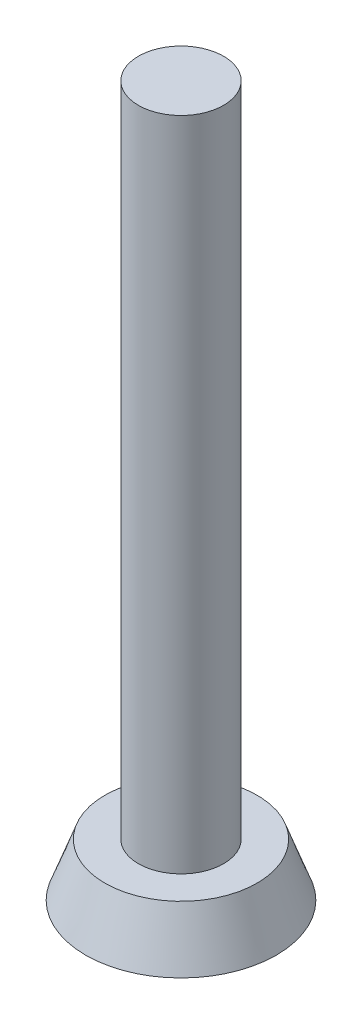
ISO-10303-21;
HEADER;
FILE_DESCRIPTION(('STEP AP214'),'2;1');
FILE_NAME('part.step','',(''),(''),'','','');
FILE_SCHEMA(('AUTOMOTIVE_DESIGN { 1 0 10303 214 1 1 1 1 }'));
ENDSEC;
DATA;
#1=APPLICATION_CONTEXT('core data for automotive mechanical design processes');
#2=APPLICATION_PROTOCOL_DEFINITION('international standard','automotive_design',2000,#1);
#3=PRODUCT_CONTEXT('',#1,'mechanical');
#4=PRODUCT('Part','Part','',(#3));
#5=PRODUCT_RELATED_PRODUCT_CATEGORY('part','',(#4));
#6=PRODUCT_DEFINITION_FORMATION('','',#4);
#7=PRODUCT_DEFINITION_CONTEXT('part definition',#1,'design');
#8=PRODUCT_DEFINITION('design','',#6,#7);
#9=PRODUCT_DEFINITION_SHAPE('','',#8);
#10=(LENGTH_UNIT() NAMED_UNIT(*) SI_UNIT(.MILLI.,.METRE.));
#11=(NAMED_UNIT(*) PLANE_ANGLE_UNIT() SI_UNIT($,.RADIAN.));
#12=(NAMED_UNIT(*) SI_UNIT($,.STERADIAN.) SOLID_ANGLE_UNIT());
#13=UNCERTAINTY_MEASURE_WITH_UNIT(LENGTH_MEASURE(1.E-05),#10,'distance_accuracy_value','');
#14=(GEOMETRIC_REPRESENTATION_CONTEXT(3) GLOBAL_UNCERTAINTY_ASSIGNED_CONTEXT((#13)) GLOBAL_UNIT_ASSIGNED_CONTEXT((#10,
#11,#12)) REPRESENTATION_CONTEXT('',''));
#15=CARTESIAN_POINT('',(0.,0.,0.));
#16=DIRECTION('',(0.,0.,1.));
#17=DIRECTION('',(1.,0.,0.));
#18=AXIS2_PLACEMENT_3D('',#15,#16,#17);
#19=CARTESIAN_POINT('',(0.,0.,0.));
#20=DIRECTION('',(0.,-1.,0.));
#21=DIRECTION('',(0.,0.,1.));
#22=AXIS2_PLACEMENT_3D('',#19,#20,#21);
#23=CONICAL_SURFACE('',#22,3.36,0.349065850398866);
#24=CARTESIAN_POINT('',(0.,1.86,0.));
#25=DIRECTION('',(0.,1.,0.));
#26=DIRECTION('',(0.,0.,1.));
#27=AXIS2_PLACEMENT_3D('',#24,#25,#26);
#28=CIRCLE('',#27,2.68301536426486);
#29=CARTESIAN_POINT('',(0.,1.86,2.68301536426486));
#30=VERTEX_POINT('',#29);
#31=EDGE_CURVE('E11',#30,#30,#28,.T.);
#32=ORIENTED_EDGE('',*,*,#31,.F.);
#33=EDGE_LOOP('',(#32));
#34=FACE_BOUND('',#33,.T.);
#35=CARTESIAN_POINT('',(0.,0.,0.));
#36=DIRECTION('',(0.,1.,0.));
#37=DIRECTION('',(0.,0.,1.));
#38=AXIS2_PLACEMENT_3D('',#35,#36,#37);
#39=CIRCLE('',#38,3.36);
#40=CARTESIAN_POINT('',(0.,0.,3.36));
#41=VERTEX_POINT('',#40);
#42=EDGE_CURVE('E40',#41,#41,#39,.T.);
#43=ORIENTED_EDGE('',*,*,#42,.T.);
#44=EDGE_LOOP('',(#43));
#45=FACE_BOUND('',#44,.T.);
#46=ADVANCED_FACE('F33',(#34,#45),#23,.T.);
#47=CARTESIAN_POINT('',(0.,1.86,0.));
#48=DIRECTION('',(0.,1.,0.));
#49=DIRECTION('',(0.,0.,1.));
#50=AXIS2_PLACEMENT_3D('',#47,#48,#49);
#51=PLANE('',#50);
#52=CARTESIAN_POINT('',(0.,1.86,0.));
#53=DIRECTION('',(0.,1.,0.));
#54=DIRECTION('',(0.,0.,1.));
#55=AXIS2_PLACEMENT_3D('',#52,#53,#54);
#56=CIRCLE('',#55,1.5);
#57=CARTESIAN_POINT('',(0.,1.86,1.5));
#58=VERTEX_POINT('',#57);
#59=EDGE_CURVE('E134',#58,#58,#56,.T.);
#60=ORIENTED_EDGE('',*,*,#59,.F.);
#61=EDGE_LOOP('',(#60));
#62=FACE_BOUND('',#61,.T.);
#63=ORIENTED_EDGE('',*,*,#31,.T.);
#64=EDGE_LOOP('',(#63));
#65=FACE_BOUND('',#64,.T.);
#66=ADVANCED_FACE('F151',(#62,#65),#51,.T.);
#67=CARTESIAN_POINT('',(0.,0.,0.));
#68=DIRECTION('',(0.,1.,0.));
#69=DIRECTION('',(0.,0.,1.));
#70=AXIS2_PLACEMENT_3D('',#67,#68,#69);
#71=PLANE('',#70);
#72=DIRECTION('',(-0.866025403784439,0.,-0.5));
#73=VECTOR('',#72,1.);
#74=CARTESIAN_POINT('',(0.,0.,1.15470053837925));
#75=LINE('',#74,#73);
#76=CARTESIAN_POINT('',(0.,0.,1.15470053837925));
#77=VERTEX_POINT('',#76);
#78=CARTESIAN_POINT('',(-1.,0.,0.577350269189626));
#79=VERTEX_POINT('',#78);
#80=EDGE_CURVE('E121',#77,#79,#75,.T.);
#81=ORIENTED_EDGE('',*,*,#80,.F.);
#82=DIRECTION('',(-0.866025403784439,0.,0.5));
#83=VECTOR('',#82,1.);
#84=CARTESIAN_POINT('',(1.,0.,0.577350269189626));
#85=LINE('',#84,#83);
#86=CARTESIAN_POINT('',(1.,0.,0.577350269189626));
#87=VERTEX_POINT('',#86);
#88=EDGE_CURVE('E47',#87,#77,#85,.T.);
#89=ORIENTED_EDGE('',*,*,#88,.F.);
#90=DIRECTION('',(0.,0.,1.));
#91=VECTOR('',#90,1.);
#92=CARTESIAN_POINT('',(1.,0.,-0.577350269189626));
#93=LINE('',#92,#91);
#94=CARTESIAN_POINT('',(1.,0.,-0.577350269189626));
#95=VERTEX_POINT('',#94);
#96=EDGE_CURVE('E130',#95,#87,#93,.T.);
#97=ORIENTED_EDGE('',*,*,#96,.F.);
#98=DIRECTION('',(0.866025403784439,0.,0.5));
#99=VECTOR('',#98,1.);
#100=CARTESIAN_POINT('',(0.,0.,-1.15470053837925));
#101=LINE('',#100,#99);
#102=CARTESIAN_POINT('',(0.,0.,-1.15470053837925));
#103=VERTEX_POINT('',#102);
#104=EDGE_CURVE('E128',#103,#95,#101,.T.);
#105=ORIENTED_EDGE('',*,*,#104,.F.);
#106=DIRECTION('',(0.866025403784439,0.,-0.5));
#107=VECTOR('',#106,1.);
#108=CARTESIAN_POINT('',(-1.,0.,-0.577350269189626));
#109=LINE('',#108,#107);
#110=CARTESIAN_POINT('',(-1.,0.,-0.577350269189626));
#111=VERTEX_POINT('',#110);
#112=EDGE_CURVE('E95',#111,#103,#109,.T.);
#113=ORIENTED_EDGE('',*,*,#112,.F.);
#114=DIRECTION('',(0.,0.,-1.));
#115=VECTOR('',#114,1.);
#116=CARTESIAN_POINT('',(-1.,0.,0.577350269189626));
#117=LINE('',#116,#115);
#118=EDGE_CURVE('E124',#79,#111,#117,.T.);
#119=ORIENTED_EDGE('',*,*,#118,.F.);
#120=EDGE_LOOP('',(#81,#89,#97,#105,#113,#119));
#121=FACE_BOUND('',#120,.T.);
#122=ORIENTED_EDGE('',*,*,#42,.F.);
#123=EDGE_LOOP('',(#122));
#124=FACE_BOUND('',#123,.T.);
#125=ADVANCED_FACE('F148',(#121,#124),#71,.F.);
#126=CARTESIAN_POINT('',(0.,25.,0.));
#127=DIRECTION('',(0.,-1.,0.));
#128=DIRECTION('',(0.,0.,-1.));
#129=AXIS2_PLACEMENT_3D('',#126,#127,#128);
#130=CYLINDRICAL_SURFACE('',#129,1.5);
#131=CARTESIAN_POINT('',(0.,25.,0.));
#132=DIRECTION('',(0.,1.,0.));
#133=DIRECTION('',(0.,0.,1.));
#134=AXIS2_PLACEMENT_3D('',#131,#132,#133);
#135=CIRCLE('',#134,1.5);
#136=CARTESIAN_POINT('',(0.,25.,1.5));
#137=VERTEX_POINT('',#136);
#138=EDGE_CURVE('E140',#137,#137,#135,.T.);
#139=ORIENTED_EDGE('',*,*,#138,.F.);
#140=EDGE_LOOP('',(#139));
#141=FACE_BOUND('',#140,.T.);
#142=ORIENTED_EDGE('',*,*,#59,.T.);
#143=EDGE_LOOP('',(#142));
#144=FACE_BOUND('',#143,.T.);
#145=ADVANCED_FACE('F150',(#141,#144),#130,.T.);
#146=CARTESIAN_POINT('',(0.,25.,0.));
#147=DIRECTION('',(0.,1.,0.));
#148=DIRECTION('',(0.,0.,1.));
#149=AXIS2_PLACEMENT_3D('',#146,#147,#148);
#150=PLANE('',#149);
#151=ORIENTED_EDGE('',*,*,#138,.T.);
#152=EDGE_LOOP('',(#151));
#153=FACE_BOUND('',#152,.T.);
#154=ADVANCED_FACE('F157',(#153),#150,.T.);
#155=CARTESIAN_POINT('',(1.,1.5,0.577350269189626));
#156=DIRECTION('',(0.5,0.,0.866025403784439));
#157=DIRECTION('',(0.866025403784439,0.,-0.5));
#158=AXIS2_PLACEMENT_3D('',#155,#156,#157);
#159=PLANE('',#158);
#160=ORIENTED_EDGE('',*,*,#88,.T.);
#161=DIRECTION('',(0.,-1.,0.));
#162=VECTOR('',#161,1.);
#163=CARTESIAN_POINT('',(0.,1.5,1.15470053837925));
#164=LINE('',#163,#162);
#165=CARTESIAN_POINT('',(0.,1.5,1.15470053837925));
#166=VERTEX_POINT('',#165);
#167=EDGE_CURVE('E77',#166,#77,#164,.T.);
#168=ORIENTED_EDGE('',*,*,#167,.F.);
#169=DIRECTION('',(-0.866025403784439,0.,0.5));
#170=VECTOR('',#169,1.);
#171=CARTESIAN_POINT('',(1.,1.5,0.577350269189626));
#172=LINE('',#171,#170);
#173=CARTESIAN_POINT('',(1.,1.5,0.577350269189626));
#174=VERTEX_POINT('',#173);
#175=EDGE_CURVE('E132',#174,#166,#172,.T.);
#176=ORIENTED_EDGE('',*,*,#175,.F.);
#177=DIRECTION('',(0.,-1.,0.));
#178=VECTOR('',#177,1.);
#179=CARTESIAN_POINT('',(1.,1.5,0.577350269189626));
#180=LINE('',#179,#178);
#181=EDGE_CURVE('E55',#174,#87,#180,.T.);
#182=ORIENTED_EDGE('',*,*,#181,.T.);
#183=EDGE_LOOP('',(#160,#168,#176,#182));
#184=FACE_BOUND('',#183,.T.);
#185=ADVANCED_FACE('F188',(#184),#159,.F.);
#186=CARTESIAN_POINT('',(1.,1.5,-0.577350269189626));
#187=DIRECTION('',(1.,0.,0.));
#188=DIRECTION('',(0.,0.,-1.));
#189=AXIS2_PLACEMENT_3D('',#186,#187,#188);
#190=PLANE('',#189);
#191=ORIENTED_EDGE('',*,*,#96,.T.);
#192=ORIENTED_EDGE('',*,*,#181,.F.);
#193=DIRECTION('',(0.,0.,1.));
#194=VECTOR('',#193,1.);
#195=CARTESIAN_POINT('',(1.,1.5,-0.577350269189626));
#196=LINE('',#195,#194);
#197=CARTESIAN_POINT('',(1.,1.5,-0.577350269189626));
#198=VERTEX_POINT('',#197);
#199=EDGE_CURVE('E107',#198,#174,#196,.T.);
#200=ORIENTED_EDGE('',*,*,#199,.F.);
#201=DIRECTION('',(0.,-1.,0.));
#202=VECTOR('',#201,1.);
#203=CARTESIAN_POINT('',(1.,1.5,-0.577350269189626));
#204=LINE('',#203,#202);
#205=EDGE_CURVE('E99',#198,#95,#204,.T.);
#206=ORIENTED_EDGE('',*,*,#205,.T.);
#207=EDGE_LOOP('',(#191,#192,#200,#206));
#208=FACE_BOUND('',#207,.T.);
#209=ADVANCED_FACE('F202',(#208),#190,.F.);
#210=CARTESIAN_POINT('',(0.,1.5,-1.15470053837925));
#211=DIRECTION('',(0.5,0.,-0.866025403784439));
#212=DIRECTION('',(-0.866025403784439,0.,-0.5));
#213=AXIS2_PLACEMENT_3D('',#210,#211,#212);
#214=PLANE('',#213);
#215=ORIENTED_EDGE('',*,*,#104,.T.);
#216=ORIENTED_EDGE('',*,*,#205,.F.);
#217=DIRECTION('',(0.866025403784439,0.,0.5));
#218=VECTOR('',#217,1.);
#219=CARTESIAN_POINT('',(0.,1.5,-1.15470053837925));
#220=LINE('',#219,#218);
#221=CARTESIAN_POINT('',(0.,1.5,-1.15470053837925));
#222=VERTEX_POINT('',#221);
#223=EDGE_CURVE('E103',#222,#198,#220,.T.);
#224=ORIENTED_EDGE('',*,*,#223,.F.);
#225=DIRECTION('',(0.,-1.,0.));
#226=VECTOR('',#225,1.);
#227=CARTESIAN_POINT('',(0.,1.5,-1.15470053837925));
#228=LINE('',#227,#226);
#229=EDGE_CURVE('E88',#222,#103,#228,.T.);
#230=ORIENTED_EDGE('',*,*,#229,.T.);
#231=EDGE_LOOP('',(#215,#216,#224,#230));
#232=FACE_BOUND('',#231,.T.);
#233=ADVANCED_FACE('F104',(#232),#214,.F.);
#234=CARTESIAN_POINT('',(-1.,1.5,-0.577350269189626));
#235=DIRECTION('',(-0.5,0.,-0.866025403784438));
#236=DIRECTION('',(-0.866025403784439,0.,0.5));
#237=AXIS2_PLACEMENT_3D('',#234,#235,#236);
#238=PLANE('',#237);
#239=ORIENTED_EDGE('',*,*,#112,.T.);
#240=ORIENTED_EDGE('',*,*,#229,.F.);
#241=DIRECTION('',(0.866025403784439,0.,-0.5));
#242=VECTOR('',#241,1.);
#243=CARTESIAN_POINT('',(-1.,1.5,-0.577350269189626));
#244=LINE('',#243,#242);
#245=CARTESIAN_POINT('',(-1.,1.5,-0.577350269189626));
#246=VERTEX_POINT('',#245);
#247=EDGE_CURVE('E92',#246,#222,#244,.T.);
#248=ORIENTED_EDGE('',*,*,#247,.F.);
#249=DIRECTION('',(0.,-1.,0.));
#250=VECTOR('',#249,1.);
#251=CARTESIAN_POINT('',(-1.,1.5,-0.577350269189626));
#252=LINE('',#251,#250);
#253=EDGE_CURVE('E100',#246,#111,#252,.T.);
#254=ORIENTED_EDGE('',*,*,#253,.T.);
#255=EDGE_LOOP('',(#239,#240,#248,#254));
#256=FACE_BOUND('',#255,.T.);
#257=ADVANCED_FACE('F90',(#256),#238,.F.);
#258=CARTESIAN_POINT('',(-1.,1.5,0.577350269189626));
#259=DIRECTION('',(-1.,0.,0.));
#260=DIRECTION('',(0.,0.,1.));
#261=AXIS2_PLACEMENT_3D('',#258,#259,#260);
#262=PLANE('',#261);
#263=ORIENTED_EDGE('',*,*,#118,.T.);
#264=ORIENTED_EDGE('',*,*,#253,.F.);
#265=DIRECTION('',(0.,0.,-1.));
#266=VECTOR('',#265,1.);
#267=CARTESIAN_POINT('',(-1.,1.5,0.577350269189626));
#268=LINE('',#267,#266);
#269=CARTESIAN_POINT('',(-1.,1.5,0.577350269189626));
#270=VERTEX_POINT('',#269);
#271=EDGE_CURVE('E113',#270,#246,#268,.T.);
#272=ORIENTED_EDGE('',*,*,#271,.F.);
#273=DIRECTION('',(0.,-1.,0.));
#274=VECTOR('',#273,1.);
#275=CARTESIAN_POINT('',(-1.,1.5,0.577350269189626));
#276=LINE('',#275,#274);
#277=EDGE_CURVE('E137',#270,#79,#276,.T.);
#278=ORIENTED_EDGE('',*,*,#277,.T.);
#279=EDGE_LOOP('',(#263,#264,#272,#278));
#280=FACE_BOUND('',#279,.T.);
#281=ADVANCED_FACE('F227',(#280),#262,.F.);
#282=CARTESIAN_POINT('',(0.,1.5,1.15470053837925));
#283=DIRECTION('',(-0.5,0.,0.866025403784439));
#284=DIRECTION('',(0.866025403784439,0.,0.5));
#285=AXIS2_PLACEMENT_3D('',#282,#283,#284);
#286=PLANE('',#285);
#287=ORIENTED_EDGE('',*,*,#80,.T.);
#288=ORIENTED_EDGE('',*,*,#277,.F.);
#289=DIRECTION('',(-0.866025403784439,0.,-0.5));
#290=VECTOR('',#289,1.);
#291=CARTESIAN_POINT('',(0.,1.5,1.15470053837925));
#292=LINE('',#291,#290);
#293=EDGE_CURVE('E115',#166,#270,#292,.T.);
#294=ORIENTED_EDGE('',*,*,#293,.F.);
#295=ORIENTED_EDGE('',*,*,#167,.T.);
#296=EDGE_LOOP('',(#287,#288,#294,#295));
#297=FACE_BOUND('',#296,.T.);
#298=ADVANCED_FACE('F236',(#297),#286,.F.);
#299=CARTESIAN_POINT('',(0.,1.5,0.));
#300=DIRECTION('',(0.,-1.,0.));
#301=DIRECTION('',(0.,0.,-1.));
#302=AXIS2_PLACEMENT_3D('',#299,#300,#301);
#303=PLANE('',#302);
#304=ORIENTED_EDGE('',*,*,#175,.T.);
#305=ORIENTED_EDGE('',*,*,#293,.T.);
#306=ORIENTED_EDGE('',*,*,#271,.T.);
#307=ORIENTED_EDGE('',*,*,#247,.T.);
#308=ORIENTED_EDGE('',*,*,#223,.T.);
#309=ORIENTED_EDGE('',*,*,#199,.T.);
#310=EDGE_LOOP('',(#304,#305,#306,#307,#308,#309));
#311=FACE_BOUND('',#310,.T.);
#312=ADVANCED_FACE('F110',(#311),#303,.T.);
#313=CLOSED_SHELL('',(#46,#66,#125,#145,#154,#185,#209,#233,#257,#281,#298,#312));
#314=MANIFOLD_SOLID_BREP('B2',#313);
#315=ADVANCED_BREP_SHAPE_REPRESENTATION('',(#18,#314),#14);
#316=SHAPE_DEFINITION_REPRESENTATION(#9,#315);
ENDSEC;
END-ISO-10303-21;
